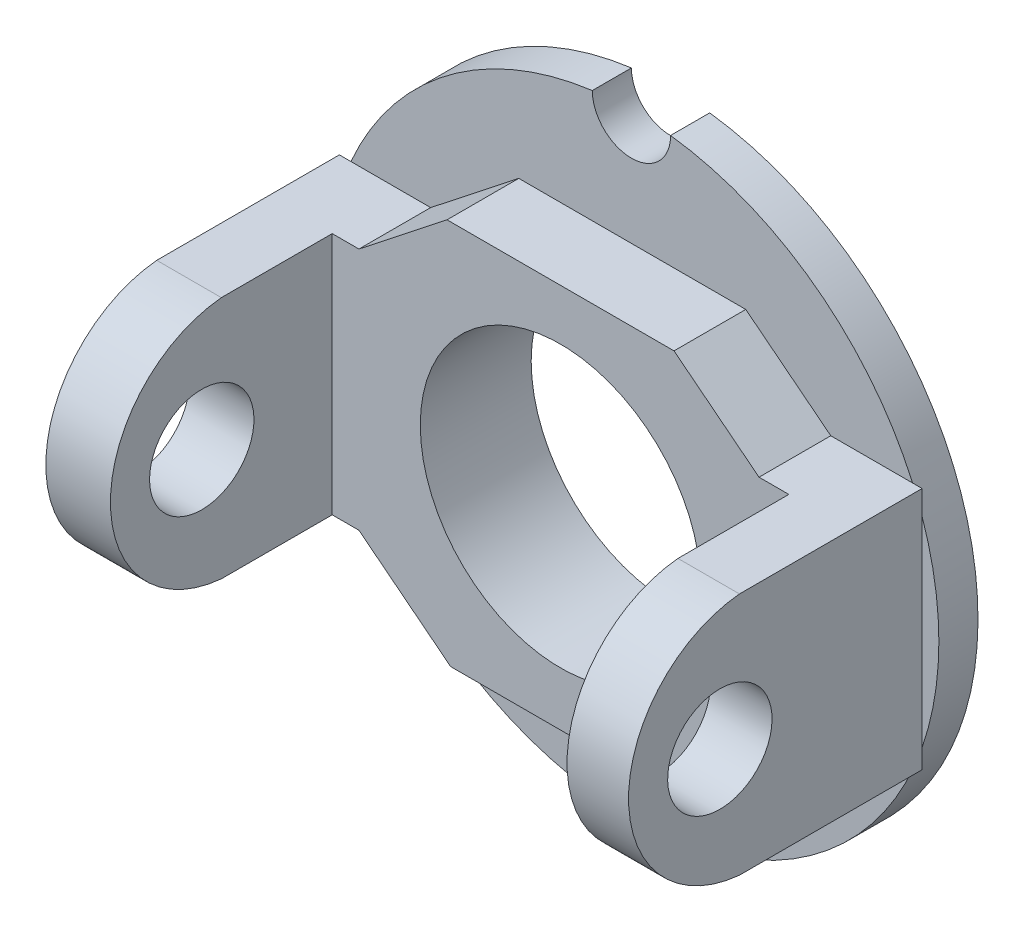
ISO-10303-21;
HEADER;
FILE_DESCRIPTION(('STEP AP214'),'2;1');
FILE_NAME('part.step','',(''),(''),'','','');
FILE_SCHEMA(('AUTOMOTIVE_DESIGN { 1 0 10303 214 1 1 1 1 }'));
ENDSEC;
DATA;
#1=APPLICATION_CONTEXT('core data for automotive mechanical design processes');
#2=APPLICATION_PROTOCOL_DEFINITION('international standard','automotive_design',2000,#1);
#3=PRODUCT_CONTEXT('',#1,'mechanical');
#4=PRODUCT('Part','Part','',(#3));
#5=PRODUCT_RELATED_PRODUCT_CATEGORY('part','',(#4));
#6=PRODUCT_DEFINITION_FORMATION('','',#4);
#7=PRODUCT_DEFINITION_CONTEXT('part definition',#1,'design');
#8=PRODUCT_DEFINITION('design','',#6,#7);
#9=PRODUCT_DEFINITION_SHAPE('','',#8);
#10=(LENGTH_UNIT() NAMED_UNIT(*) SI_UNIT(.MILLI.,.METRE.));
#11=(NAMED_UNIT(*) PLANE_ANGLE_UNIT() SI_UNIT($,.RADIAN.));
#12=(NAMED_UNIT(*) SI_UNIT($,.STERADIAN.) SOLID_ANGLE_UNIT());
#13=UNCERTAINTY_MEASURE_WITH_UNIT(LENGTH_MEASURE(1.E-05),#10,'distance_accuracy_value','');
#14=(GEOMETRIC_REPRESENTATION_CONTEXT(3) GLOBAL_UNCERTAINTY_ASSIGNED_CONTEXT((#13)) GLOBAL_UNIT_ASSIGNED_CONTEXT((#10,
#11,#12)) REPRESENTATION_CONTEXT('',''));
#15=CARTESIAN_POINT('',(0.,0.,0.));
#16=DIRECTION('',(0.,0.,1.));
#17=DIRECTION('',(1.,0.,0.));
#18=AXIS2_PLACEMENT_3D('',#15,#16,#17);
#19=CARTESIAN_POINT('',(22.2147106784625,0.,8.5));
#20=DIRECTION('',(1.,0.,0.));
#21=DIRECTION('',(0.,1.,0.));
#22=AXIS2_PLACEMENT_3D('',#19,#20,#21);
#23=PLANE('',#22);
#24=CARTESIAN_POINT('',(22.2147106784625,-0.0236961405543032,18.5031826355078));
#25=DIRECTION('',(1.,0.,0.));
#26=DIRECTION('',(0.,1.,0.));
#27=AXIS2_PLACEMENT_3D('',#24,#25,#26);
#28=CIRCLE('',#27,4.);
#29=CARTESIAN_POINT('',(22.2147106784625,3.9763038594457,18.5031826355078));
#30=VERTEX_POINT('',#29);
#31=EDGE_CURVE('E802',#30,#30,#28,.T.);
#32=ORIENTED_EDGE('',*,*,#31,.F.);
#33=EDGE_LOOP('',(#32));
#34=FACE_BOUND('',#33,.T.);
#35=CARTESIAN_POINT('',(22.2147106784625,0.187364912083141,16.1239867647059));
#36=DIRECTION('',(-1.,0.,0.));
#37=DIRECTION('',(0.,-1.,0.));
#38=AXIS2_PLACEMENT_3D('',#35,#36,#37);
#39=CIRCLE('',#38,9.37601323529412);
#40=CARTESIAN_POINT('',(22.2147106784625,-9.14763508791686,17.));
#41=VERTEX_POINT('',#40);
#42=CARTESIAN_POINT('',(22.2147106784625,9.52236491208314,17.));
#43=VERTEX_POINT('',#42);
#44=EDGE_CURVE('E185',#41,#43,#39,.T.);
#45=ORIENTED_EDGE('',*,*,#44,.F.);
#46=DIRECTION('',(0.,0.,-1.));
#47=VECTOR('',#46,1.);
#48=CARTESIAN_POINT('',(22.2147106784625,-9.14763508791686,8.5));
#49=LINE('',#48,#47);
#50=CARTESIAN_POINT('',(22.2147106784625,-9.14763508791686,3.));
#51=VERTEX_POINT('',#50);
#52=EDGE_CURVE('E207',#41,#51,#49,.T.);
#53=ORIENTED_EDGE('',*,*,#52,.T.);
#54=DIRECTION('',(0.,-1.,0.));
#55=VECTOR('',#54,1.);
#56=CARTESIAN_POINT('',(22.2147106784625,0.,3.));
#57=LINE('',#56,#55);
#58=CARTESIAN_POINT('',(22.2147106784625,-7.6652873052617,3.));
#59=VERTEX_POINT('',#58);
#60=EDGE_CURVE('E46',#59,#51,#57,.T.);
#61=ORIENTED_EDGE('',*,*,#60,.F.);
#62=CARTESIAN_POINT('',(22.2147106784625,7.66528730526171,3.));
#63=VERTEX_POINT('',#62);
#64=EDGE_CURVE('E11',#63,#59,#57,.T.);
#65=ORIENTED_EDGE('',*,*,#64,.F.);
#66=CARTESIAN_POINT('',(22.2147106784625,9.52236491208314,3.));
#67=VERTEX_POINT('',#66);
#68=EDGE_CURVE('E45',#67,#63,#57,.T.);
#69=ORIENTED_EDGE('',*,*,#68,.F.);
#70=DIRECTION('',(0.,0.,-1.));
#71=VECTOR('',#70,1.);
#72=CARTESIAN_POINT('',(22.2147106784625,9.52236491208314,8.5));
#73=LINE('',#72,#71);
#74=EDGE_CURVE('E199',#43,#67,#73,.T.);
#75=ORIENTED_EDGE('',*,*,#74,.F.);
#76=EDGE_LOOP('',(#45,#53,#61,#65,#69,#75));
#77=FACE_BOUND('',#76,.T.);
#78=ADVANCED_FACE('F34',(#34,#77),#23,.T.);
#79=CARTESIAN_POINT('',(17.5,9.52236491208314,25.5));
#80=DIRECTION('',(1.,0.,0.));
#81=DIRECTION('',(0.,1.,0.));
#82=AXIS2_PLACEMENT_3D('',#79,#80,#81);
#83=PLANE('',#82);
#84=CARTESIAN_POINT('',(17.5,-0.0236961405543041,18.5031826355078));
#85=DIRECTION('',(1.,0.,0.));
#86=DIRECTION('',(0.,1.,0.));
#87=AXIS2_PLACEMENT_3D('',#84,#85,#86);
#88=CIRCLE('',#87,4.);
#89=CARTESIAN_POINT('',(17.5,3.9763038594457,18.5031826355078));
#90=VERTEX_POINT('',#89);
#91=EDGE_CURVE('E38',#90,#90,#88,.T.);
#92=ORIENTED_EDGE('',*,*,#91,.T.);
#93=EDGE_LOOP('',(#92));
#94=FACE_BOUND('',#93,.T.);
#95=DIRECTION('',(0.,0.,-1.));
#96=VECTOR('',#95,1.);
#97=CARTESIAN_POINT('',(17.5,-9.14763508791686,25.5));
#98=LINE('',#97,#96);
#99=CARTESIAN_POINT('',(17.5,-9.14763508791686,17.));
#100=VERTEX_POINT('',#99);
#101=CARTESIAN_POINT('',(17.5,-9.14763508791686,8.5));
#102=VERTEX_POINT('',#101);
#103=EDGE_CURVE('E275',#100,#102,#98,.T.);
#104=ORIENTED_EDGE('',*,*,#103,.F.);
#105=CARTESIAN_POINT('',(17.5,0.18736491208314,16.1239867647059));
#106=DIRECTION('',(1.,0.,0.));
#107=DIRECTION('',(0.,1.,0.));
#108=AXIS2_PLACEMENT_3D('',#105,#106,#107);
#109=CIRCLE('',#108,9.37601323529412);
#110=CARTESIAN_POINT('',(17.5,9.52236491208314,17.));
#111=VERTEX_POINT('',#110);
#112=EDGE_CURVE('E53',#100,#111,#109,.F.);
#113=ORIENTED_EDGE('',*,*,#112,.T.);
#114=DIRECTION('',(0.,0.,-1.));
#115=VECTOR('',#114,1.);
#116=CARTESIAN_POINT('',(17.5,9.52236491208314,25.5));
#117=LINE('',#116,#115);
#118=CARTESIAN_POINT('',(17.5,9.52236491208314,8.5));
#119=VERTEX_POINT('',#118);
#120=EDGE_CURVE('E202',#111,#119,#117,.T.);
#121=ORIENTED_EDGE('',*,*,#120,.T.);
#122=DIRECTION('',(0.,-1.,0.));
#123=VECTOR('',#122,1.);
#124=CARTESIAN_POINT('',(17.5,9.52236491208314,8.5));
#125=LINE('',#124,#123);
#126=EDGE_CURVE('E272',#119,#102,#125,.T.);
#127=ORIENTED_EDGE('',*,*,#126,.T.);
#128=EDGE_LOOP('',(#104,#113,#121,#127));
#129=FACE_BOUND('',#128,.T.);
#130=ADVANCED_FACE('F423',(#94,#129),#83,.F.);
#131=CARTESIAN_POINT('',(-22.4527235202593,0.,8.5));
#132=DIRECTION('',(1.,0.,0.));
#133=DIRECTION('',(0.,0.,-1.));
#134=AXIS2_PLACEMENT_3D('',#131,#132,#133);
#135=PLANE('',#134);
#136=CARTESIAN_POINT('',(-22.4527235202593,0.00174040851145366,18.5000002163587));
#137=DIRECTION('',(-1.,0.,0.));
#138=DIRECTION('',(0.,0.,1.));
#139=AXIS2_PLACEMENT_3D('',#136,#137,#138);
#140=CIRCLE('',#139,4.);
#141=CARTESIAN_POINT('',(-22.4527235202593,0.00174040851145366,22.5000002163587));
#142=VERTEX_POINT('',#141);
#143=EDGE_CURVE('E256',#142,#142,#140,.T.);
#144=ORIENTED_EDGE('',*,*,#143,.F.);
#145=EDGE_LOOP('',(#144));
#146=FACE_BOUND('',#145,.T.);
#147=DIRECTION('',(0.,0.,-1.));
#148=VECTOR('',#147,1.);
#149=CARTESIAN_POINT('',(-22.4527235202593,-9.335,8.5));
#150=LINE('',#149,#148);
#151=CARTESIAN_POINT('',(-22.4527235202593,-9.335,17.));
#152=VERTEX_POINT('',#151);
#153=CARTESIAN_POINT('',(-22.4527235202593,-9.335,3.));
#154=VERTEX_POINT('',#153);
#155=EDGE_CURVE('E228',#152,#154,#150,.T.);
#156=ORIENTED_EDGE('',*,*,#155,.F.);
#157=CARTESIAN_POINT('',(-22.4527235202593,0.,16.1239867647059));
#158=DIRECTION('',(1.,0.,0.));
#159=DIRECTION('',(0.,0.,-1.));
#160=AXIS2_PLACEMENT_3D('',#157,#158,#159);
#161=CIRCLE('',#160,9.37601323529412);
#162=CARTESIAN_POINT('',(-22.4527235202593,9.335,17.));
#163=VERTEX_POINT('',#162);
#164=EDGE_CURVE('E255',#163,#152,#161,.T.);
#165=ORIENTED_EDGE('',*,*,#164,.F.);
#166=DIRECTION('',(0.,0.,-1.));
#167=VECTOR('',#166,1.);
#168=CARTESIAN_POINT('',(-22.4527235202593,9.335,8.5));
#169=LINE('',#168,#167);
#170=CARTESIAN_POINT('',(-22.4527235202593,9.335,3.));
#171=VERTEX_POINT('',#170);
#172=EDGE_CURVE('E230',#163,#171,#169,.T.);
#173=ORIENTED_EDGE('',*,*,#172,.T.);
#174=DIRECTION('',(0.,-1.,0.));
#175=VECTOR('',#174,1.);
#176=CARTESIAN_POINT('',(-22.4527235202593,0.,3.));
#177=LINE('',#176,#175);
#178=CARTESIAN_POINT('',(-22.4527235202593,6.93723334786977,3.));
#179=VERTEX_POINT('',#178);
#180=EDGE_CURVE('E323',#171,#179,#177,.T.);
#181=ORIENTED_EDGE('',*,*,#180,.T.);
#182=CARTESIAN_POINT('',(-22.4527235202593,-6.93723334786977,3.));
#183=VERTEX_POINT('',#182);
#184=EDGE_CURVE('E43',#179,#183,#177,.T.);
#185=ORIENTED_EDGE('',*,*,#184,.T.);
#186=EDGE_CURVE('E322',#183,#154,#177,.T.);
#187=ORIENTED_EDGE('',*,*,#186,.T.);
#188=EDGE_LOOP('',(#156,#165,#173,#181,#185,#187));
#189=FACE_BOUND('',#188,.T.);
#190=ADVANCED_FACE('F425',(#146,#189),#135,.F.);
#191=CARTESIAN_POINT('',(-17.5,9.335,25.5));
#192=DIRECTION('',(-1.,0.,0.));
#193=DIRECTION('',(0.,-1.,0.));
#194=AXIS2_PLACEMENT_3D('',#191,#192,#193);
#195=PLANE('',#194);
#196=CARTESIAN_POINT('',(-17.5,0.00174040851145366,18.5000002163587));
#197=DIRECTION('',(-1.,0.,0.));
#198=DIRECTION('',(0.,-1.,0.));
#199=AXIS2_PLACEMENT_3D('',#196,#197,#198);
#200=CIRCLE('',#199,4.);
#201=CARTESIAN_POINT('',(-17.5,-3.99825959148855,18.5000002163587));
#202=VERTEX_POINT('',#201);
#203=EDGE_CURVE('E253',#202,#202,#200,.T.);
#204=ORIENTED_EDGE('',*,*,#203,.T.);
#205=EDGE_LOOP('',(#204));
#206=FACE_BOUND('',#205,.T.);
#207=DIRECTION('',(0.,0.,-1.));
#208=VECTOR('',#207,1.);
#209=CARTESIAN_POINT('',(-17.5,9.335,25.5));
#210=LINE('',#209,#208);
#211=CARTESIAN_POINT('',(-17.5,9.335,17.));
#212=VERTEX_POINT('',#211);
#213=CARTESIAN_POINT('',(-17.5,9.335,8.5));
#214=VERTEX_POINT('',#213);
#215=EDGE_CURVE('E281',#212,#214,#210,.T.);
#216=ORIENTED_EDGE('',*,*,#215,.F.);
#217=CARTESIAN_POINT('',(-17.5,0.,16.1239867647059));
#218=DIRECTION('',(-1.,0.,0.));
#219=DIRECTION('',(0.,-1.,0.));
#220=AXIS2_PLACEMENT_3D('',#217,#218,#219);
#221=CIRCLE('',#220,9.37601323529412);
#222=CARTESIAN_POINT('',(-17.5,-9.335,17.));
#223=VERTEX_POINT('',#222);
#224=EDGE_CURVE('E61',#212,#223,#221,.F.);
#225=ORIENTED_EDGE('',*,*,#224,.T.);
#226=DIRECTION('',(0.,0.,-1.));
#227=VECTOR('',#226,1.);
#228=CARTESIAN_POINT('',(-17.5,-9.335,25.5));
#229=LINE('',#228,#227);
#230=CARTESIAN_POINT('',(-17.5,-9.335,8.5));
#231=VERTEX_POINT('',#230);
#232=EDGE_CURVE('E283',#223,#231,#229,.T.);
#233=ORIENTED_EDGE('',*,*,#232,.T.);
#234=DIRECTION('',(0.,1.,0.));
#235=VECTOR('',#234,1.);
#236=CARTESIAN_POINT('',(-17.5,9.335,8.5));
#237=LINE('',#236,#235);
#238=EDGE_CURVE('E278',#231,#214,#237,.T.);
#239=ORIENTED_EDGE('',*,*,#238,.T.);
#240=EDGE_LOOP('',(#216,#225,#233,#239));
#241=FACE_BOUND('',#240,.T.);
#242=ADVANCED_FACE('F402',(#206,#241),#195,.F.);
#243=CARTESIAN_POINT('',(0.,0.,8.5));
#244=DIRECTION('',(0.,0.,1.));
#245=DIRECTION('',(1.,0.,0.));
#246=AXIS2_PLACEMENT_3D('',#243,#244,#245);
#247=PLANE('',#246);
#248=CARTESIAN_POINT('',(0.,0.,8.5));
#249=DIRECTION('',(0.,0.,1.));
#250=DIRECTION('',(1.,0.,0.));
#251=AXIS2_PLACEMENT_3D('',#248,#249,#250);
#252=CIRCLE('',#251,10.75);
#253=CARTESIAN_POINT('',(10.75,0.,8.5));
#254=VERTEX_POINT('',#253);
#255=EDGE_CURVE('E315',#254,#254,#252,.F.);
#256=ORIENTED_EDGE('',*,*,#255,.T.);
#257=EDGE_LOOP('',(#256));
#258=FACE_BOUND('',#257,.T.);
#259=DIRECTION('',(1.,0.,0.));
#260=VECTOR('',#259,1.);
#261=CARTESIAN_POINT('',(0.,-9.14763508791686,8.5));
#262=LINE('',#261,#260);
#263=CARTESIAN_POINT('',(15.2147106784625,-9.14763508791686,8.5));
#264=VERTEX_POINT('',#263);
#265=EDGE_CURVE('E301',#264,#102,#262,.T.);
#266=ORIENTED_EDGE('',*,*,#265,.T.);
#267=ORIENTED_EDGE('',*,*,#126,.F.);
#268=DIRECTION('',(1.,0.,0.));
#269=VECTOR('',#268,1.);
#270=CARTESIAN_POINT('',(0.,9.52236491208314,8.5));
#271=LINE('',#270,#269);
#272=CARTESIAN_POINT('',(15.2147106784625,9.52236491208314,8.5));
#273=VERTEX_POINT('',#272);
#274=EDGE_CURVE('E304',#273,#119,#271,.T.);
#275=ORIENTED_EDGE('',*,*,#274,.F.);
#276=DIRECTION('',(0.785748948580454,-0.618545543840314,0.));
#277=VECTOR('',#276,1.);
#278=CARTESIAN_POINT('',(10.4492010300799,13.2737981942535,8.5));
#279=LINE('',#278,#277);
#280=CARTESIAN_POINT('',(8.7,14.650778086357,8.5));
#281=VERTEX_POINT('',#280);
#282=EDGE_CURVE('E306',#281,#273,#279,.T.);
#283=ORIENTED_EDGE('',*,*,#282,.F.);
#284=DIRECTION('',(1.,0.,0.));
#285=VECTOR('',#284,1.);
#286=CARTESIAN_POINT('',(0.,14.650778086357,8.5));
#287=LINE('',#286,#285);
#288=CARTESIAN_POINT('',(-8.7,14.650778086357,8.5));
#289=VERTEX_POINT('',#288);
#290=EDGE_CURVE('E309',#289,#281,#287,.T.);
#291=ORIENTED_EDGE('',*,*,#290,.F.);
#292=DIRECTION('',(0.785748948580454,0.618545543840315,0.));
#293=VECTOR('',#292,1.);
#294=CARTESIAN_POINT('',(-10.4492010300799,13.2737981942534,8.5));
#295=LINE('',#294,#293);
#296=CARTESIAN_POINT('',(-15.4527235202593,9.335,8.5));
#297=VERTEX_POINT('',#296);
#298=EDGE_CURVE('E312',#297,#289,#295,.T.);
#299=ORIENTED_EDGE('',*,*,#298,.F.);
#300=DIRECTION('',(-1.,0.,0.));
#301=VECTOR('',#300,1.);
#302=CARTESIAN_POINT('',(0.,9.335,8.5));
#303=LINE('',#302,#301);
#304=EDGE_CURVE('E286',#297,#214,#303,.T.);
#305=ORIENTED_EDGE('',*,*,#304,.T.);
#306=ORIENTED_EDGE('',*,*,#238,.F.);
#307=DIRECTION('',(-1.,0.,0.));
#308=VECTOR('',#307,1.);
#309=CARTESIAN_POINT('',(0.,-9.335,8.5));
#310=LINE('',#309,#308);
#311=CARTESIAN_POINT('',(-15.4527235202593,-9.335,8.5));
#312=VERTEX_POINT('',#311);
#313=EDGE_CURVE('E289',#312,#231,#310,.T.);
#314=ORIENTED_EDGE('',*,*,#313,.F.);
#315=DIRECTION('',(-0.785748948580459,0.618545543840309,0.));
#316=VECTOR('',#315,1.);
#317=CARTESIAN_POINT('',(-10.4492010300798,-13.2737981942535,8.5));
#318=LINE('',#317,#316);
#319=CARTESIAN_POINT('',(-8.422507082424,-14.869221913643,8.5));
#320=VERTEX_POINT('',#319);
#321=EDGE_CURVE('E293',#320,#312,#318,.T.);
#322=ORIENTED_EDGE('',*,*,#321,.F.);
#323=DIRECTION('',(1.,0.,0.));
#324=VECTOR('',#323,1.);
#325=CARTESIAN_POINT('',(0.,-14.869221913643,8.5));
#326=LINE('',#325,#324);
#327=CARTESIAN_POINT('',(7.94648139883036,-14.869221913643,8.5));
#328=VERTEX_POINT('',#327);
#329=EDGE_CURVE('E296',#320,#328,#326,.T.);
#330=ORIENTED_EDGE('',*,*,#329,.T.);
#331=DIRECTION('',(-0.785748948580459,-0.618545543840309,0.));
#332=VECTOR('',#331,1.);
#333=CARTESIAN_POINT('',(10.267074274826,-13.042439472371,8.5));
#334=LINE('',#333,#332);
#335=EDGE_CURVE('E298',#264,#328,#334,.T.);
#336=ORIENTED_EDGE('',*,*,#335,.F.);
#337=EDGE_LOOP('',(#266,#267,#275,#283,#291,#299,#305,#306,#314,#322,#330,#336));
#338=FACE_BOUND('',#337,.T.);
#339=ADVANCED_FACE('F370',(#258,#338),#247,.T.);
#340=CARTESIAN_POINT('',(-0.0332731557539049,11.6538137343801,3.));
#341=DIRECTION('',(0.,0.,1.));
#342=DIRECTION('',(1.,0.,0.));
#343=AXIS2_PLACEMENT_3D('',#340,#341,#342);
#344=PLANE('',#343);
#345=CARTESIAN_POINT('',(0.,0.,3.));
#346=DIRECTION('',(0.,0.,1.));
#347=DIRECTION('',(-1.,0.,0.));
#348=AXIS2_PLACEMENT_3D('',#345,#346,#347);
#349=CIRCLE('',#348,23.5);
#350=EDGE_CURVE('E380',#59,#63,#349,.T.);
#351=ORIENTED_EDGE('',*,*,#350,.T.);
#352=ORIENTED_EDGE('',*,*,#64,.T.);
#353=EDGE_LOOP('',(#351,#352));
#354=FACE_BOUND('',#353,.T.);
#355=ADVANCED_FACE('F445',(#354),#344,.T.);
#356=DIRECTION('',(-1.,0.,0.));
#357=VECTOR('',#356,1.);
#358=CARTESIAN_POINT('',(0.,9.335,3.));
#359=LINE('',#358,#357);
#360=CARTESIAN_POINT('',(-15.4527235202593,9.335,3.));
#361=VERTEX_POINT('',#360);
#362=CARTESIAN_POINT('',(-21.5663574810398,9.335,3.));
#363=VERTEX_POINT('',#362);
#364=EDGE_CURVE('E319',#361,#363,#359,.T.);
#365=ORIENTED_EDGE('',*,*,#364,.F.);
#366=DIRECTION('',(0.785748948580454,0.618545543840315,0.));
#367=VECTOR('',#366,1.);
#368=CARTESIAN_POINT('',(-10.4492010300799,13.2737981942534,3.));
#369=LINE('',#368,#367);
#370=CARTESIAN_POINT('',(-8.7,14.650778086357,3.));
#371=VERTEX_POINT('',#370);
#372=EDGE_CURVE('E290',#361,#371,#369,.T.);
#373=ORIENTED_EDGE('',*,*,#372,.T.);
#374=DIRECTION('',(1.,0.,0.));
#375=VECTOR('',#374,1.);
#376=CARTESIAN_POINT('',(0.,14.650778086357,3.));
#377=LINE('',#376,#375);
#378=CARTESIAN_POINT('',(8.7,14.650778086357,3.));
#379=VERTEX_POINT('',#378);
#380=EDGE_CURVE('E345',#371,#379,#377,.T.);
#381=ORIENTED_EDGE('',*,*,#380,.T.);
#382=DIRECTION('',(0.785748948580454,-0.618545543840314,0.));
#383=VECTOR('',#382,1.);
#384=CARTESIAN_POINT('',(10.4492010300799,13.2737981942535,3.));
#385=LINE('',#384,#383);
#386=CARTESIAN_POINT('',(15.2147106784625,9.52236491208314,3.));
#387=VERTEX_POINT('',#386);
#388=EDGE_CURVE('E343',#379,#387,#385,.T.);
#389=ORIENTED_EDGE('',*,*,#388,.T.);
#390=DIRECTION('',(1.,0.,0.));
#391=VECTOR('',#390,1.);
#392=CARTESIAN_POINT('',(0.,9.52236491208314,3.));
#393=LINE('',#392,#391);
#394=CARTESIAN_POINT('',(21.4842865015603,9.52236491208314,3.));
#395=VERTEX_POINT('',#394);
#396=EDGE_CURVE('E341',#387,#395,#393,.T.);
#397=ORIENTED_EDGE('',*,*,#396,.T.);
#398=CARTESIAN_POINT('',(2.93345368849219,23.3161928594158,3.));
#399=VERTEX_POINT('',#398);
#400=EDGE_CURVE('E239',#395,#399,#349,.T.);
#401=ORIENTED_EDGE('',*,*,#400,.T.);
#402=CARTESIAN_POINT('',(-0.0665463115078098,23.3076274687603,3.));
#403=DIRECTION('',(0.,0.,-1.));
#404=DIRECTION('',(1.,0.,0.));
#405=AXIS2_PLACEMENT_3D('',#402,#403,#404);
#406=CIRCLE('',#405,3.00001222762793);
#407=CARTESIAN_POINT('',(-3.06654631150781,23.2990620781047,3.));
#408=VERTEX_POINT('',#407);
#409=EDGE_CURVE('E236',#399,#408,#406,.T.);
#410=ORIENTED_EDGE('',*,*,#409,.T.);
#411=EDGE_CURVE('E241',#408,#363,#349,.T.);
#412=ORIENTED_EDGE('',*,*,#411,.T.);
#413=EDGE_LOOP('',(#365,#373,#381,#389,#397,#401,#410,#412));
#414=FACE_BOUND('',#413,.T.);
#415=ADVANCED_FACE('F363',(#414),#344,.T.);
#416=DIRECTION('',(1.,0.,0.));
#417=VECTOR('',#416,1.);
#418=CARTESIAN_POINT('',(0.,-9.14763508791686,3.));
#419=LINE('',#418,#417);
#420=CARTESIAN_POINT('',(15.2147106784625,-9.14763508791686,3.));
#421=VERTEX_POINT('',#420);
#422=CARTESIAN_POINT('',(21.6464956124152,-9.14763508791686,3.));
#423=VERTEX_POINT('',#422);
#424=EDGE_CURVE('E337',#421,#423,#419,.T.);
#425=ORIENTED_EDGE('',*,*,#424,.F.);
#426=DIRECTION('',(-0.785748948580459,-0.618545543840309,0.));
#427=VECTOR('',#426,1.);
#428=CARTESIAN_POINT('',(10.267074274826,-13.042439472371,3.));
#429=LINE('',#428,#427);
#430=CARTESIAN_POINT('',(7.94648139883036,-14.869221913643,3.));
#431=VERTEX_POINT('',#430);
#432=EDGE_CURVE('E334',#421,#431,#429,.T.);
#433=ORIENTED_EDGE('',*,*,#432,.T.);
#434=DIRECTION('',(1.,0.,0.));
#435=VECTOR('',#434,1.);
#436=CARTESIAN_POINT('',(0.,-14.869221913643,3.));
#437=LINE('',#436,#435);
#438=CARTESIAN_POINT('',(-8.422507082424,-14.869221913643,3.));
#439=VERTEX_POINT('',#438);
#440=EDGE_CURVE('E331',#439,#431,#437,.T.);
#441=ORIENTED_EDGE('',*,*,#440,.F.);
#442=DIRECTION('',(-0.785748948580459,0.618545543840309,0.));
#443=VECTOR('',#442,1.);
#444=CARTESIAN_POINT('',(-10.4492010300798,-13.2737981942535,3.));
#445=LINE('',#444,#443);
#446=CARTESIAN_POINT('',(-15.4527235202593,-9.335,3.));
#447=VERTEX_POINT('',#446);
#448=EDGE_CURVE('E329',#439,#447,#445,.T.);
#449=ORIENTED_EDGE('',*,*,#448,.T.);
#450=DIRECTION('',(-1.,0.,0.));
#451=VECTOR('',#450,1.);
#452=CARTESIAN_POINT('',(0.,-9.335,3.));
#453=LINE('',#452,#451);
#454=CARTESIAN_POINT('',(-21.5663574810398,-9.335,3.));
#455=VERTEX_POINT('',#454);
#456=EDGE_CURVE('E327',#447,#455,#453,.T.);
#457=ORIENTED_EDGE('',*,*,#456,.T.);
#458=EDGE_CURVE('E822',#455,#423,#349,.T.);
#459=ORIENTED_EDGE('',*,*,#458,.T.);
#460=EDGE_LOOP('',(#425,#433,#441,#449,#457,#459));
#461=FACE_BOUND('',#460,.T.);
#462=ADVANCED_FACE('F478',(#461),#344,.T.);
#463=ORIENTED_EDGE('',*,*,#184,.F.);
#464=EDGE_CURVE('E820',#179,#183,#349,.T.);
#465=ORIENTED_EDGE('',*,*,#464,.T.);
#466=EDGE_LOOP('',(#463,#465));
#467=FACE_BOUND('',#466,.T.);
#468=ADVANCED_FACE('F474',(#467),#344,.T.);
#469=CARTESIAN_POINT('',(-0.0332731557539049,11.6538137343801,0.));
#470=DIRECTION('',(0.,0.,1.));
#471=DIRECTION('',(1.,0.,0.));
#472=AXIS2_PLACEMENT_3D('',#469,#470,#471);
#473=PLANE('',#472);
#474=CARTESIAN_POINT('',(-0.0665463115078098,23.3076274687603,0.));
#475=DIRECTION('',(0.,0.,-1.));
#476=DIRECTION('',(1.,0.,0.));
#477=AXIS2_PLACEMENT_3D('',#474,#475,#476);
#478=CIRCLE('',#477,3.00001222762793);
#479=CARTESIAN_POINT('',(2.93345368849219,23.3161928594158,0.));
#480=VERTEX_POINT('',#479);
#481=CARTESIAN_POINT('',(-3.06654631150781,23.2990620781047,0.));
#482=VERTEX_POINT('',#481);
#483=EDGE_CURVE('E235',#480,#482,#478,.T.);
#484=ORIENTED_EDGE('',*,*,#483,.F.);
#485=CARTESIAN_POINT('',(0.,0.,0.));
#486=DIRECTION('',(0.,0.,1.));
#487=DIRECTION('',(-1.,0.,0.));
#488=AXIS2_PLACEMENT_3D('',#485,#486,#487);
#489=CIRCLE('',#488,23.5);
#490=EDGE_CURVE('E240',#482,#480,#489,.T.);
#491=ORIENTED_EDGE('',*,*,#490,.F.);
#492=EDGE_LOOP('',(#484,#491));
#493=FACE_BOUND('',#492,.T.);
#494=CARTESIAN_POINT('',(0.,0.,0.));
#495=DIRECTION('',(0.,0.,1.));
#496=DIRECTION('',(1.,0.,0.));
#497=AXIS2_PLACEMENT_3D('',#494,#495,#496);
#498=CIRCLE('',#497,10.75);
#499=CARTESIAN_POINT('',(10.75,0.,0.));
#500=VERTEX_POINT('',#499);
#501=EDGE_CURVE('E232',#500,#500,#498,.T.);
#502=ORIENTED_EDGE('',*,*,#501,.T.);
#503=EDGE_LOOP('',(#502));
#504=FACE_BOUND('',#503,.T.);
#505=ADVANCED_FACE('F477',(#493,#504),#473,.F.);
#506=CARTESIAN_POINT('',(-0.0665463115078098,23.3076274687603,3.));
#507=DIRECTION('',(0.,0.,-1.));
#508=DIRECTION('',(-1.,0.,0.));
#509=AXIS2_PLACEMENT_3D('',#506,#507,#508);
#510=CYLINDRICAL_SURFACE('',#509,3.00001222762793);
#511=ORIENTED_EDGE('',*,*,#483,.T.);
#512=DIRECTION('',(0.,0.,-1.));
#513=VECTOR('',#512,1.);
#514=CARTESIAN_POINT('',(-3.06654631150781,23.2990620781047,3.));
#515=LINE('',#514,#513);
#516=EDGE_CURVE('E251',#408,#482,#515,.T.);
#517=ORIENTED_EDGE('',*,*,#516,.F.);
#518=ORIENTED_EDGE('',*,*,#409,.F.);
#519=DIRECTION('',(0.,0.,-1.));
#520=VECTOR('',#519,1.);
#521=CARTESIAN_POINT('',(2.93345368849219,23.3161928594158,3.));
#522=LINE('',#521,#520);
#523=EDGE_CURVE('E244',#399,#480,#522,.T.);
#524=ORIENTED_EDGE('',*,*,#523,.T.);
#525=EDGE_LOOP('',(#511,#517,#518,#524));
#526=FACE_BOUND('',#525,.T.);
#527=ADVANCED_FACE('F36',(#526),#510,.F.);
#528=CARTESIAN_POINT('',(0.,0.,3.));
#529=DIRECTION('',(0.,0.,-1.));
#530=DIRECTION('',(-1.,0.,0.));
#531=AXIS2_PLACEMENT_3D('',#528,#529,#530);
#532=CYLINDRICAL_SURFACE('',#531,23.5);
#533=ORIENTED_EDGE('',*,*,#490,.T.);
#534=ORIENTED_EDGE('',*,*,#523,.F.);
#535=ORIENTED_EDGE('',*,*,#400,.F.);
#536=EDGE_CURVE('E376',#63,#395,#349,.T.);
#537=ORIENTED_EDGE('',*,*,#536,.F.);
#538=ORIENTED_EDGE('',*,*,#350,.F.);
#539=EDGE_CURVE('E381',#423,#59,#349,.T.);
#540=ORIENTED_EDGE('',*,*,#539,.F.);
#541=ORIENTED_EDGE('',*,*,#458,.F.);
#542=EDGE_CURVE('E817',#183,#455,#349,.T.);
#543=ORIENTED_EDGE('',*,*,#542,.F.);
#544=ORIENTED_EDGE('',*,*,#464,.F.);
#545=EDGE_CURVE('E245',#363,#179,#349,.T.);
#546=ORIENTED_EDGE('',*,*,#545,.F.);
#547=ORIENTED_EDGE('',*,*,#411,.F.);
#548=ORIENTED_EDGE('',*,*,#516,.T.);
#549=EDGE_LOOP('',(#533,#534,#535,#537,#538,#540,#541,#543,#544,#546,#547,#548));
#550=FACE_BOUND('',#549,.T.);
#551=ADVANCED_FACE('F385',(#550),#532,.T.);
#552=CARTESIAN_POINT('',(0.,0.,3.));
#553=DIRECTION('',(0.,0.,-1.));
#554=DIRECTION('',(-1.,0.,0.));
#555=AXIS2_PLACEMENT_3D('',#552,#553,#554);
#556=CYLINDRICAL_SURFACE('',#555,10.75);
#557=ORIENTED_EDGE('',*,*,#501,.F.);
#558=EDGE_LOOP('',(#557));
#559=FACE_BOUND('',#558,.T.);
#560=ORIENTED_EDGE('',*,*,#255,.F.);
#561=EDGE_LOOP('',(#560));
#562=FACE_BOUND('',#561,.T.);
#563=ADVANCED_FACE('F450',(#559,#562),#556,.F.);
#564=CARTESIAN_POINT('',(0.,0.,3.));
#565=DIRECTION('',(0.,0.,1.));
#566=DIRECTION('',(1.,0.,0.));
#567=AXIS2_PLACEMENT_3D('',#564,#565,#566);
#568=PLANE('',#567);
#569=EDGE_CURVE('E285',#363,#171,#359,.T.);
#570=ORIENTED_EDGE('',*,*,#569,.F.);
#571=ORIENTED_EDGE('',*,*,#545,.T.);
#572=ORIENTED_EDGE('',*,*,#180,.F.);
#573=EDGE_LOOP('',(#570,#571,#572));
#574=FACE_BOUND('',#573,.T.);
#575=ADVANCED_FACE('F394',(#574),#568,.F.);
#576=ORIENTED_EDGE('',*,*,#186,.F.);
#577=ORIENTED_EDGE('',*,*,#542,.T.);
#578=EDGE_CURVE('E326',#455,#154,#453,.T.);
#579=ORIENTED_EDGE('',*,*,#578,.T.);
#580=EDGE_LOOP('',(#576,#577,#579));
#581=FACE_BOUND('',#580,.T.);
#582=ADVANCED_FACE('F449',(#581),#568,.F.);
#583=EDGE_CURVE('E336',#423,#51,#419,.T.);
#584=ORIENTED_EDGE('',*,*,#583,.F.);
#585=ORIENTED_EDGE('',*,*,#539,.T.);
#586=ORIENTED_EDGE('',*,*,#60,.T.);
#587=EDGE_LOOP('',(#584,#585,#586));
#588=FACE_BOUND('',#587,.T.);
#589=ADVANCED_FACE('F562',(#588),#568,.F.);
#590=ORIENTED_EDGE('',*,*,#68,.T.);
#591=ORIENTED_EDGE('',*,*,#536,.T.);
#592=EDGE_CURVE('E340',#395,#67,#393,.T.);
#593=ORIENTED_EDGE('',*,*,#592,.T.);
#594=EDGE_LOOP('',(#590,#591,#593));
#595=FACE_BOUND('',#594,.T.);
#596=ADVANCED_FACE('F375',(#595),#568,.F.);
#597=CARTESIAN_POINT('',(0.,9.335,8.5));
#598=DIRECTION('',(0.,-1.,0.));
#599=DIRECTION('',(1.,0.,0.));
#600=AXIS2_PLACEMENT_3D('',#597,#598,#599);
#601=PLANE('',#600);
#602=ORIENTED_EDGE('',*,*,#172,.F.);
#603=DIRECTION('',(-1.,0.,0.));
#604=VECTOR('',#603,1.);
#605=CARTESIAN_POINT('',(-5.45272352025927,9.335,17.));
#606=LINE('',#605,#604);
#607=EDGE_CURVE('E267',#212,#163,#606,.T.);
#608=ORIENTED_EDGE('',*,*,#607,.F.);
#609=ORIENTED_EDGE('',*,*,#215,.T.);
#610=ORIENTED_EDGE('',*,*,#304,.F.);
#611=DIRECTION('',(0.,0.,-1.));
#612=VECTOR('',#611,1.);
#613=CARTESIAN_POINT('',(-15.4527235202593,9.335,8.5));
#614=LINE('',#613,#612);
#615=EDGE_CURVE('E318',#297,#361,#614,.T.);
#616=ORIENTED_EDGE('',*,*,#615,.T.);
#617=ORIENTED_EDGE('',*,*,#364,.T.);
#618=ORIENTED_EDGE('',*,*,#569,.T.);
#619=EDGE_LOOP('',(#602,#608,#609,#610,#616,#617,#618));
#620=FACE_BOUND('',#619,.T.);
#621=ADVANCED_FACE('F397',(#620),#601,.F.);
#622=CARTESIAN_POINT('',(0.,-9.335,8.5));
#623=DIRECTION('',(0.,-1.,0.));
#624=DIRECTION('',(1.,0.,0.));
#625=AXIS2_PLACEMENT_3D('',#622,#623,#624);
#626=PLANE('',#625);
#627=DIRECTION('',(-1.,0.,0.));
#628=VECTOR('',#627,1.);
#629=CARTESIAN_POINT('',(-5.45272352025927,-9.335,17.));
#630=LINE('',#629,#628);
#631=EDGE_CURVE('E259',#223,#152,#630,.T.);
#632=ORIENTED_EDGE('',*,*,#631,.T.);
#633=ORIENTED_EDGE('',*,*,#155,.T.);
#634=ORIENTED_EDGE('',*,*,#578,.F.);
#635=ORIENTED_EDGE('',*,*,#456,.F.);
#636=DIRECTION('',(0.,0.,-1.));
#637=VECTOR('',#636,1.);
#638=CARTESIAN_POINT('',(-15.4527235202593,-9.335,8.5));
#639=LINE('',#638,#637);
#640=EDGE_CURVE('E225',#312,#447,#639,.T.);
#641=ORIENTED_EDGE('',*,*,#640,.F.);
#642=ORIENTED_EDGE('',*,*,#313,.T.);
#643=ORIENTED_EDGE('',*,*,#232,.F.);
#644=EDGE_LOOP('',(#632,#633,#634,#635,#641,#642,#643));
#645=FACE_BOUND('',#644,.T.);
#646=ADVANCED_FACE('F405',(#645),#626,.T.);
#647=CARTESIAN_POINT('',(-10.4492010300798,-13.2737981942535,8.5));
#648=DIRECTION('',(-0.618545543840309,-0.785748948580459,0.));
#649=DIRECTION('',(0.785748948580459,-0.618545543840309,0.));
#650=AXIS2_PLACEMENT_3D('',#647,#648,#649);
#651=PLANE('',#650);
#652=ORIENTED_EDGE('',*,*,#448,.F.);
#653=DIRECTION('',(0.,0.,-1.));
#654=VECTOR('',#653,1.);
#655=CARTESIAN_POINT('',(-8.422507082424,-14.869221913643,8.5));
#656=LINE('',#655,#654);
#657=EDGE_CURVE('E222',#320,#439,#656,.T.);
#658=ORIENTED_EDGE('',*,*,#657,.F.);
#659=ORIENTED_EDGE('',*,*,#321,.T.);
#660=ORIENTED_EDGE('',*,*,#640,.T.);
#661=EDGE_LOOP('',(#652,#658,#659,#660));
#662=FACE_BOUND('',#661,.T.);
#663=ADVANCED_FACE('F411',(#662),#651,.T.);
#664=CARTESIAN_POINT('',(0.,-14.869221913643,8.5));
#665=DIRECTION('',(0.,1.,0.));
#666=DIRECTION('',(0.,0.,1.));
#667=AXIS2_PLACEMENT_3D('',#664,#665,#666);
#668=PLANE('',#667);
#669=ORIENTED_EDGE('',*,*,#440,.T.);
#670=DIRECTION('',(0.,0.,-1.));
#671=VECTOR('',#670,1.);
#672=CARTESIAN_POINT('',(7.94648139883036,-14.869221913643,8.5));
#673=LINE('',#672,#671);
#674=EDGE_CURVE('E219',#328,#431,#673,.T.);
#675=ORIENTED_EDGE('',*,*,#674,.F.);
#676=ORIENTED_EDGE('',*,*,#329,.F.);
#677=ORIENTED_EDGE('',*,*,#657,.T.);
#678=EDGE_LOOP('',(#669,#675,#676,#677));
#679=FACE_BOUND('',#678,.T.);
#680=ADVANCED_FACE('F415',(#679),#668,.F.);
#681=CARTESIAN_POINT('',(10.267074274826,-13.042439472371,8.5));
#682=DIRECTION('',(0.618545543840309,-0.785748948580459,0.));
#683=DIRECTION('',(0.785748948580459,0.618545543840309,0.));
#684=AXIS2_PLACEMENT_3D('',#681,#682,#683);
#685=PLANE('',#684);
#686=ORIENTED_EDGE('',*,*,#432,.F.);
#687=DIRECTION('',(0.,0.,-1.));
#688=VECTOR('',#687,1.);
#689=CARTESIAN_POINT('',(15.2147106784625,-9.14763508791686,8.5));
#690=LINE('',#689,#688);
#691=EDGE_CURVE('E210',#264,#421,#690,.T.);
#692=ORIENTED_EDGE('',*,*,#691,.F.);
#693=ORIENTED_EDGE('',*,*,#335,.T.);
#694=ORIENTED_EDGE('',*,*,#674,.T.);
#695=EDGE_LOOP('',(#686,#692,#693,#694));
#696=FACE_BOUND('',#695,.T.);
#697=ADVANCED_FACE('F420',(#696),#685,.T.);
#698=CARTESIAN_POINT('',(0.,-9.14763508791686,8.5));
#699=DIRECTION('',(0.,1.,0.));
#700=DIRECTION('',(-1.,0.,0.));
#701=AXIS2_PLACEMENT_3D('',#698,#699,#700);
#702=PLANE('',#701);
#703=ORIENTED_EDGE('',*,*,#52,.F.);
#704=DIRECTION('',(1.,0.,0.));
#705=VECTOR('',#704,1.);
#706=CARTESIAN_POINT('',(5.21471067846245,-9.14763508791686,17.));
#707=LINE('',#706,#705);
#708=EDGE_CURVE('E191',#100,#41,#707,.T.);
#709=ORIENTED_EDGE('',*,*,#708,.F.);
#710=ORIENTED_EDGE('',*,*,#103,.T.);
#711=ORIENTED_EDGE('',*,*,#265,.F.);
#712=ORIENTED_EDGE('',*,*,#691,.T.);
#713=ORIENTED_EDGE('',*,*,#424,.T.);
#714=ORIENTED_EDGE('',*,*,#583,.T.);
#715=EDGE_LOOP('',(#703,#709,#710,#711,#712,#713,#714));
#716=FACE_BOUND('',#715,.T.);
#717=ADVANCED_FACE('F422',(#716),#702,.F.);
#718=CARTESIAN_POINT('',(0.,9.52236491208314,8.5));
#719=DIRECTION('',(0.,1.,0.));
#720=DIRECTION('',(0.,0.,1.));
#721=AXIS2_PLACEMENT_3D('',#718,#719,#720);
#722=PLANE('',#721);
#723=DIRECTION('',(1.,0.,0.));
#724=VECTOR('',#723,1.);
#725=CARTESIAN_POINT('',(5.21471067846245,9.52236491208314,17.));
#726=LINE('',#725,#724);
#727=EDGE_CURVE('E188',#111,#43,#726,.T.);
#728=ORIENTED_EDGE('',*,*,#727,.T.);
#729=ORIENTED_EDGE('',*,*,#74,.T.);
#730=ORIENTED_EDGE('',*,*,#592,.F.);
#731=ORIENTED_EDGE('',*,*,#396,.F.);
#732=DIRECTION('',(0.,0.,-1.));
#733=VECTOR('',#732,1.);
#734=CARTESIAN_POINT('',(15.2147106784625,9.52236491208314,8.5));
#735=LINE('',#734,#733);
#736=EDGE_CURVE('E208',#273,#387,#735,.T.);
#737=ORIENTED_EDGE('',*,*,#736,.F.);
#738=ORIENTED_EDGE('',*,*,#274,.T.);
#739=ORIENTED_EDGE('',*,*,#120,.F.);
#740=EDGE_LOOP('',(#728,#729,#730,#731,#737,#738,#739));
#741=FACE_BOUND('',#740,.T.);
#742=ADVANCED_FACE('F197',(#741),#722,.T.);
#743=CARTESIAN_POINT('',(10.4492010300799,13.2737981942535,8.5));
#744=DIRECTION('',(0.618545543840314,0.785748948580455,0.));
#745=DIRECTION('',(-0.785748948580455,0.618545543840314,0.));
#746=AXIS2_PLACEMENT_3D('',#743,#744,#745);
#747=PLANE('',#746);
#748=ORIENTED_EDGE('',*,*,#388,.F.);
#749=DIRECTION('',(0.,0.,-1.));
#750=VECTOR('',#749,1.);
#751=CARTESIAN_POINT('',(8.7,14.650778086357,8.5));
#752=LINE('',#751,#750);
#753=EDGE_CURVE('E213',#281,#379,#752,.T.);
#754=ORIENTED_EDGE('',*,*,#753,.F.);
#755=ORIENTED_EDGE('',*,*,#282,.T.);
#756=ORIENTED_EDGE('',*,*,#736,.T.);
#757=EDGE_LOOP('',(#748,#754,#755,#756));
#758=FACE_BOUND('',#757,.T.);
#759=ADVANCED_FACE('F360',(#758),#747,.T.);
#760=CARTESIAN_POINT('',(0.,14.650778086357,8.5));
#761=DIRECTION('',(0.,1.,0.));
#762=DIRECTION('',(0.,0.,1.));
#763=AXIS2_PLACEMENT_3D('',#760,#761,#762);
#764=PLANE('',#763);
#765=ORIENTED_EDGE('',*,*,#380,.F.);
#766=DIRECTION('',(0.,0.,-1.));
#767=VECTOR('',#766,1.);
#768=CARTESIAN_POINT('',(-8.7,14.650778086357,8.5));
#769=LINE('',#768,#767);
#770=EDGE_CURVE('E350',#289,#371,#769,.T.);
#771=ORIENTED_EDGE('',*,*,#770,.F.);
#772=ORIENTED_EDGE('',*,*,#290,.T.);
#773=ORIENTED_EDGE('',*,*,#753,.T.);
#774=EDGE_LOOP('',(#765,#771,#772,#773));
#775=FACE_BOUND('',#774,.T.);
#776=ADVANCED_FACE('F356',(#775),#764,.T.);
#777=CARTESIAN_POINT('',(-10.4492010300799,13.2737981942534,8.5));
#778=DIRECTION('',(-0.618545543840315,0.785748948580454,0.));
#779=DIRECTION('',(-0.785748948580454,-0.618545543840315,0.));
#780=AXIS2_PLACEMENT_3D('',#777,#778,#779);
#781=PLANE('',#780);
#782=ORIENTED_EDGE('',*,*,#372,.F.);
#783=ORIENTED_EDGE('',*,*,#615,.F.);
#784=ORIENTED_EDGE('',*,*,#298,.T.);
#785=ORIENTED_EDGE('',*,*,#770,.T.);
#786=EDGE_LOOP('',(#782,#783,#784,#785));
#787=FACE_BOUND('',#786,.T.);
#788=ADVANCED_FACE('F367',(#787),#781,.T.);
#789=CARTESIAN_POINT('',(-5.45272352025927,0.,16.1239867647059));
#790=DIRECTION('',(-1.,0.,0.));
#791=DIRECTION('',(0.,0.,1.));
#792=AXIS2_PLACEMENT_3D('',#789,#790,#791);
#793=CYLINDRICAL_SURFACE('',#792,9.37601323529412);
#794=ORIENTED_EDGE('',*,*,#607,.T.);
#795=ORIENTED_EDGE('',*,*,#164,.T.);
#796=ORIENTED_EDGE('',*,*,#631,.F.);
#797=ORIENTED_EDGE('',*,*,#224,.F.);
#798=EDGE_LOOP('',(#794,#795,#796,#797));
#799=FACE_BOUND('',#798,.T.);
#800=ADVANCED_FACE('F439',(#799),#793,.T.);
#801=CARTESIAN_POINT('',(-5.45272352025927,0.00174040851145366,18.5000002163587));
#802=DIRECTION('',(-1.,0.,0.));
#803=DIRECTION('',(0.,0.,1.));
#804=AXIS2_PLACEMENT_3D('',#801,#802,#803);
#805=CYLINDRICAL_SURFACE('',#804,4.);
#806=ORIENTED_EDGE('',*,*,#143,.T.);
#807=EDGE_LOOP('',(#806));
#808=FACE_BOUND('',#807,.T.);
#809=ORIENTED_EDGE('',*,*,#203,.F.);
#810=EDGE_LOOP('',(#809));
#811=FACE_BOUND('',#810,.T.);
#812=ADVANCED_FACE('F538',(#808,#811),#805,.F.);
#813=CARTESIAN_POINT('',(5.21471067846245,0.187364912083138,16.1239867647059));
#814=DIRECTION('',(1.,0.,0.));
#815=DIRECTION('',(0.,1.,0.));
#816=AXIS2_PLACEMENT_3D('',#813,#814,#815);
#817=CYLINDRICAL_SURFACE('',#816,9.37601323529412);
#818=ORIENTED_EDGE('',*,*,#708,.T.);
#819=ORIENTED_EDGE('',*,*,#44,.T.);
#820=ORIENTED_EDGE('',*,*,#727,.F.);
#821=ORIENTED_EDGE('',*,*,#112,.F.);
#822=EDGE_LOOP('',(#818,#819,#820,#821));
#823=FACE_BOUND('',#822,.T.);
#824=ADVANCED_FACE('F187',(#823),#817,.T.);
#825=CARTESIAN_POINT('',(5.21471067846245,-0.0236961405543064,18.5031826355078));
#826=DIRECTION('',(1.,0.,0.));
#827=DIRECTION('',(0.,1.,0.));
#828=AXIS2_PLACEMENT_3D('',#825,#826,#827);
#829=CYLINDRICAL_SURFACE('',#828,4.);
#830=ORIENTED_EDGE('',*,*,#31,.T.);
#831=EDGE_LOOP('',(#830));
#832=FACE_BOUND('',#831,.T.);
#833=ORIENTED_EDGE('',*,*,#91,.F.);
#834=EDGE_LOOP('',(#833));
#835=FACE_BOUND('',#834,.T.);
#836=ADVANCED_FACE('F773',(#832,#835),#829,.F.);
#837=CLOSED_SHELL('',(#78,#130,#190,#242,#339,#355,#415,#462,#468,#505,#527,#551,#563,#575,#582,
#589,#596,#621,#646,#663,#680,#697,#717,#742,#759,#776,#788,#800,#812,#824,#836));
#838=MANIFOLD_SOLID_BREP('B2',#837);
#839=ADVANCED_BREP_SHAPE_REPRESENTATION('',(#18,#838),#14);
#840=SHAPE_DEFINITION_REPRESENTATION(#9,#839);
ENDSEC;
END-ISO-10303-21;
